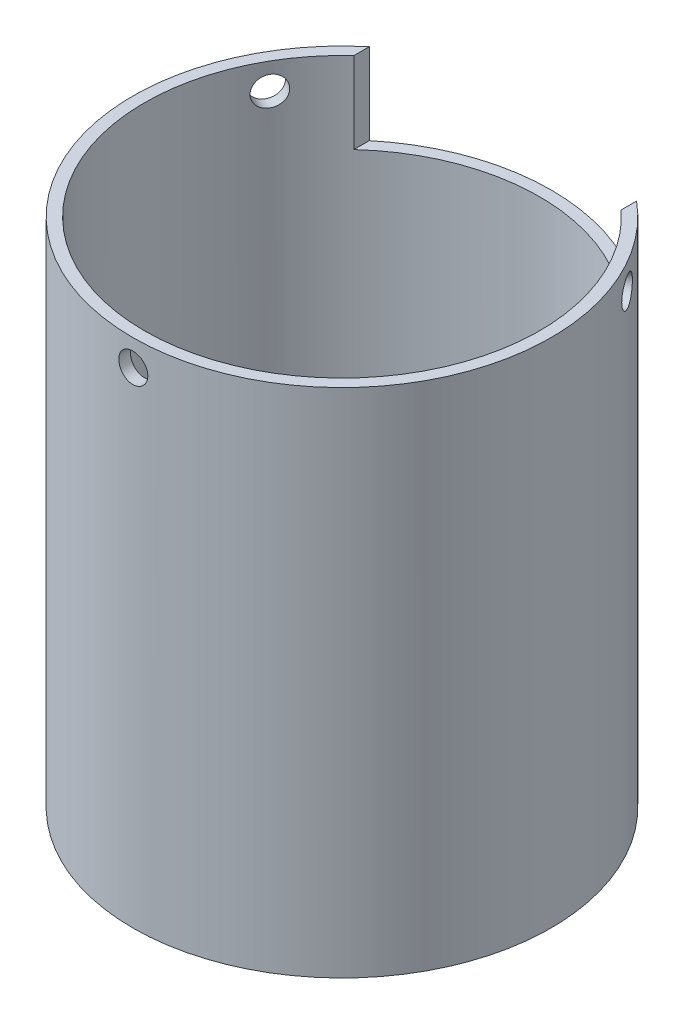
ISO-10303-21;
HEADER;
FILE_DESCRIPTION(('STEP AP214'),'2;1');
FILE_NAME('part.step','',(''),(''),'','','');
FILE_SCHEMA(('AUTOMOTIVE_DESIGN { 1 0 10303 214 1 1 1 1 }'));
ENDSEC;
DATA;
#1=APPLICATION_CONTEXT('core data for automotive mechanical design processes');
#2=APPLICATION_PROTOCOL_DEFINITION('international standard','automotive_design',2000,#1);
#3=PRODUCT_CONTEXT('',#1,'mechanical');
#4=PRODUCT('Part','Part','',(#3));
#5=PRODUCT_RELATED_PRODUCT_CATEGORY('part','',(#4));
#6=PRODUCT_DEFINITION_FORMATION('','',#4);
#7=PRODUCT_DEFINITION_CONTEXT('part definition',#1,'design');
#8=PRODUCT_DEFINITION('design','',#6,#7);
#9=PRODUCT_DEFINITION_SHAPE('','',#8);
#10=(LENGTH_UNIT() NAMED_UNIT(*) SI_UNIT(.MILLI.,.METRE.));
#11=(NAMED_UNIT(*) PLANE_ANGLE_UNIT() SI_UNIT($,.RADIAN.));
#12=(NAMED_UNIT(*) SI_UNIT($,.STERADIAN.) SOLID_ANGLE_UNIT());
#13=UNCERTAINTY_MEASURE_WITH_UNIT(LENGTH_MEASURE(1.E-05),#10,'distance_accuracy_value','');
#14=(GEOMETRIC_REPRESENTATION_CONTEXT(3) GLOBAL_UNCERTAINTY_ASSIGNED_CONTEXT((#13)) GLOBAL_UNIT_ASSIGNED_CONTEXT((#10,
#11,#12)) REPRESENTATION_CONTEXT('',''));
#15=CARTESIAN_POINT('',(0.,0.,0.));
#16=DIRECTION('',(0.,0.,1.));
#17=DIRECTION('',(1.,0.,0.));
#18=AXIS2_PLACEMENT_3D('',#15,#16,#17);
#19=CARTESIAN_POINT('',(0.,44.,0.));
#20=DIRECTION('',(0.,-1.,0.));
#21=DIRECTION('',(0.,0.,-1.));
#22=AXIS2_PLACEMENT_3D('',#19,#20,#21);
#23=CYLINDRICAL_SURFACE('',#22,18.);
#24=CARTESIAN_POINT('',(0.,44.,0.));
#25=DIRECTION('',(0.,1.,0.));
#26=DIRECTION('',(0.,0.,1.));
#27=AXIS2_PLACEMENT_3D('',#24,#25,#26);
#28=CIRCLE('',#27,18.);
#29=CARTESIAN_POINT('',(-11.5,44.,-13.8473824241262));
#30=VERTEX_POINT('',#29);
#31=CARTESIAN_POINT('',(11.5,44.,-13.8473824241262));
#32=VERTEX_POINT('',#31);
#33=EDGE_CURVE('E103',#30,#32,#28,.T.);
#34=ORIENTED_EDGE('',*,*,#33,.F.);
#35=DIRECTION('',(0.,-1.,0.));
#36=VECTOR('',#35,1.);
#37=CARTESIAN_POINT('',(-11.5,44.,-13.8473824241262));
#38=LINE('',#37,#36);
#39=CARTESIAN_POINT('',(-11.5,37.,-13.8473824241262));
#40=VERTEX_POINT('',#39);
#41=EDGE_CURVE('E88',#30,#40,#38,.T.);
#42=ORIENTED_EDGE('',*,*,#41,.T.);
#43=CARTESIAN_POINT('',(0.,37.,0.));
#44=DIRECTION('',(0.,1.,0.));
#45=DIRECTION('',(0.,0.,1.));
#46=AXIS2_PLACEMENT_3D('',#43,#44,#45);
#47=CIRCLE('',#46,18.);
#48=CARTESIAN_POINT('',(11.5,37.,-13.8473824241262));
#49=VERTEX_POINT('',#48);
#50=EDGE_CURVE('E160',#49,#40,#47,.T.);
#51=ORIENTED_EDGE('',*,*,#50,.F.);
#52=DIRECTION('',(0.,-1.,0.));
#53=VECTOR('',#52,1.);
#54=CARTESIAN_POINT('',(11.5,44.,-13.8473824241262));
#55=LINE('',#54,#53);
#56=EDGE_CURVE('E96',#32,#49,#55,.T.);
#57=ORIENTED_EDGE('',*,*,#56,.F.);
#58=EDGE_LOOP('',(#34,#42,#51,#57));
#59=FACE_BOUND('',#58,.T.);
#60=CARTESIAN_POINT('',(0.,0.,0.));
#61=DIRECTION('',(0.,1.,0.));
#62=DIRECTION('',(0.,0.,1.));
#63=AXIS2_PLACEMENT_3D('',#60,#61,#62);
#64=CIRCLE('',#63,18.);
#65=CARTESIAN_POINT('',(0.,0.,18.));
#66=VERTEX_POINT('',#65);
#67=EDGE_CURVE('E110',#66,#66,#64,.T.);
#68=ORIENTED_EDGE('',*,*,#67,.T.);
#69=EDGE_LOOP('',(#68));
#70=FACE_BOUND('',#69,.T.);
#71=CARTESIAN_POINT('',(-1.25,41.75,17.9565447678555));
#72=CARTESIAN_POINT('',(-1.24999692087245,41.679877836503,17.9565453475551));
#73=CARTESIAN_POINT('',(-1.24407962332092,41.60970698361,17.9569599379391));
#74=CARTESIAN_POINT('',(-1.22055995909646,41.47130405784,17.9585736340928));
#75=CARTESIAN_POINT('',(-1.2029441002899,41.4030743185426,17.9597736456779));
#76=CARTESIAN_POINT('',(-1.15653679886206,41.2705783633108,17.9628216098129));
#77=CARTESIAN_POINT('',(-1.12775138697274,41.2063100301731,17.9646692126594));
#78=CARTESIAN_POINT('',(-1.05983215341319,41.0835336767476,17.9688037374603));
#79=CARTESIAN_POINT('',(-1.0207006538079,41.0250243679489,17.9710905608051));
#80=CARTESIAN_POINT('',(-0.933122260331687,40.9153038614367,17.9758505608922));
#81=CARTESIAN_POINT('',(-0.884660449683299,40.8641045819849,17.9783240321337));
#82=CARTESIAN_POINT('',(-0.779828188185755,40.7705596374055,17.9831759029143));
#83=CARTESIAN_POINT('',(-0.723457402971796,40.7282143467834,17.9855542984285));
#84=CARTESIAN_POINT('',(-0.604338712936122,40.6535416920058,17.9899506663012));
#85=CARTESIAN_POINT('',(-0.541584512203469,40.6212243480678,17.9919682773059));
#86=CARTESIAN_POINT('',(-0.411524431040373,40.5675890860505,17.9954126129922));
#87=CARTESIAN_POINT('',(-0.344218608660133,40.5462710277191,17.9968393452081));
#88=CARTESIAN_POINT('',(-0.207082042920345,40.5152729844266,17.9989391241091));
#89=CARTESIAN_POINT('',(-0.137255588146259,40.5055741107522,17.9996133939115));
#90=CARTESIAN_POINT('',(0.00303724364685374,40.4980314019916,18.0001364029419));
#91=CARTESIAN_POINT('',(0.0735036120242584,40.5001874070499,17.9999851533017));
#92=CARTESIAN_POINT('',(0.212948009338198,40.5162777164302,17.9988751825149));
#93=CARTESIAN_POINT('',(0.281928395125417,40.530191704847,17.997917854153));
#94=CARTESIAN_POINT('',(0.416572169367042,40.5693714679473,17.995305076866));
#95=CARTESIAN_POINT('',(0.482235534552961,40.5946373222503,17.9936496230444));
#96=CARTESIAN_POINT('',(0.608446374060544,40.6558265082304,17.9898245419831));
#97=CARTESIAN_POINT('',(0.668989386654918,40.6917590140469,17.9876544724588));
#98=CARTESIAN_POINT('',(0.783192212040235,40.7732548424093,17.9830442781478));
#99=CARTESIAN_POINT('',(0.836851928584343,40.8188182995979,17.9806041495857));
#100=CARTESIAN_POINT('',(0.935883598513189,40.9183973197933,17.9757222588037));
#101=CARTESIAN_POINT('',(0.981237817297813,40.9724305221571,17.9732805040092));
#102=CARTESIAN_POINT('',(1.06223423290604,41.0873535287451,17.9686757864437));
#103=CARTESIAN_POINT('',(1.09787642481368,41.1482433364399,17.9665128238137));
#104=CARTESIAN_POINT('',(1.15843595045764,41.2751627451254,17.9627100242511));
#105=CARTESIAN_POINT('',(1.18335248496743,41.3411927287056,17.9610702263046));
#106=CARTESIAN_POINT('',(1.22174089648704,41.4765127406929,17.9585000082334));
#107=CARTESIAN_POINT('',(1.23521293993592,41.5458027216737,17.9575695777923));
#108=CARTESIAN_POINT('',(1.25030774544695,41.6855209974855,17.9565249662407));
#109=CARTESIAN_POINT('',(1.25195518340671,41.7559466142377,17.9564090853173));
#110=CARTESIAN_POINT('',(1.24341853566185,41.896073128502,17.9570021980803));
#111=CARTESIAN_POINT('',(1.23323452619032,41.9657740306807,17.9577111864519));
#112=CARTESIAN_POINT('',(1.20134459026408,42.1024024650606,17.9598725926874));
#113=CARTESIAN_POINT('',(1.17965007392972,42.1693326730866,17.9613242742845));
#114=CARTESIAN_POINT('',(1.12536652129504,42.2986024981628,17.9648068631197));
#115=CARTESIAN_POINT('',(1.0927773630921,42.3609420638377,17.9668377768389));
#116=CARTESIAN_POINT('',(1.01756674162157,42.4793742320995,17.9712540999677));
#117=CARTESIAN_POINT('',(0.974928771470821,42.535456329972,17.9736400902485));
#118=CARTESIAN_POINT('',(0.880854829968361,42.6396756721795,17.9784956909298));
#119=CARTESIAN_POINT('',(0.829418752879545,42.6878128210172,17.9809653023351));
#120=CARTESIAN_POINT('',(0.71910234587548,42.7748594442495,17.9857148668945));
#121=CARTESIAN_POINT('',(0.660209384545826,42.8137529311725,17.98799448709));
#122=CARTESIAN_POINT('',(0.536714304438726,42.8810986999746,17.9921024233477));
#123=CARTESIAN_POINT('',(0.472112227545764,42.9095510584462,17.9939307427204));
#124=CARTESIAN_POINT('',(0.339091057628252,42.9551792082367,17.9969285029299));
#125=CARTESIAN_POINT('',(0.270675425002747,42.9723650476595,17.998098530735));
#126=CARTESIAN_POINT('',(0.131921301517095,42.9950051871856,17.999650230487));
#127=CARTESIAN_POINT('',(0.0615828348509802,43.0004596348303,18.0000319123487));
#128=CARTESIAN_POINT('',(-0.0788622728534465,42.9994806529565,17.9999639410066));
#129=CARTESIAN_POINT('',(-0.148969090279524,42.9930722109983,17.9995160352152));
#130=CARTESIAN_POINT('',(-0.28710855262058,42.9686012623451,17.9978427052476));
#131=CARTESIAN_POINT('',(-0.355141194100978,42.9505387363535,17.996617279784));
#132=CARTESIAN_POINT('',(-0.48720416237324,42.9032782277334,17.9935265696128));
#133=CARTESIAN_POINT('',(-0.551234567790456,42.8740804639408,17.9916612974799));
#134=CARTESIAN_POINT('',(-0.673488058153857,42.8053815085425,17.9875000948006));
#135=CARTESIAN_POINT('',(-0.731711275829397,42.7658805525018,17.9852041741007));
#136=CARTESIAN_POINT('',(-0.840824910647018,42.6776034228431,17.9804340098156));
#137=CARTESIAN_POINT('',(-0.89170054489359,42.6288089961239,17.9779594213535));
#138=CARTESIAN_POINT('',(-0.98455733867083,42.5233581728663,17.973113669139));
#139=CARTESIAN_POINT('',(-1.02653632556802,42.4666998614811,17.9707425307619));
#140=CARTESIAN_POINT('',(-1.10044689471235,42.3470514074416,17.966368404823));
#141=CARTESIAN_POINT('',(-1.13236403890677,42.2840523355828,17.9643659479912));
#142=CARTESIAN_POINT('',(-1.18512806194755,42.1536205186862,17.960962587565));
#143=CARTESIAN_POINT('',(-1.2059878348875,42.0861930412755,17.9595609836776));
#144=CARTESIAN_POINT('',(-1.23065604288959,41.97363113737,17.9578832926674));
#145=CARTESIAN_POINT('',(-1.23790056796128,41.9292232721005,17.9573836081703));
#146=CARTESIAN_POINT('',(-1.24757352921097,41.8398836068265,17.9567141602468));
#147=CARTESIAN_POINT('',(-1.25000197387449,41.7949518077454,17.9565443962392));
#148=CARTESIAN_POINT('',(-1.25,41.75,17.9565447678555));
#149=B_SPLINE_CURVE_WITH_KNOTS('',3,(#71,#72,#73,#74,#75,#76,#77,#78,#79,#80,#81,#82,#83,#84,
#85,#86,#87,#88,#89,#90,#91,#92,#93,#94,#95,#96,#97,#98,#99,#100,#101,#102,#103,#104,#105,#106,
#107,#108,#109,#110,#111,#112,#113,#114,#115,#116,#117,#118,#119,#120,#121,#122,#123,#124,#125,
#126,#127,#128,#129,#130,#131,#132,#133,#134,#135,#136,#137,#138,#139,#140,#141,#142,#143,#144,
#145,#146,#147,#148),.UNSPECIFIED.,.T.,.F.,(4,2,2,2,2,2,2,2,2,2,2,2,2,2,2,2,2,2,2,2,2,2,2,2,2,2,
2,2,2,2,2,2,2,2,2,2,2,2,4),(0.,0.210202380966778,0.420647613628741,0.630979379191793,
0.841263978130896,1.05188760268292,1.26252013437695,1.47336246348711,1.6842021040758,
1.89469852632505,2.1051921101703,2.31532273683045,2.52545483732622,2.73576819379824,
2.94608449069139,3.15684476546426,3.36760514691818,3.57838123054665,3.78915424877224,
3.9994872920975,4.20981898019974,4.41994255945194,4.63006848990324,4.84054202380325,
5.0510180873868,5.2618555751644,5.47269151627751,5.68333916551951,5.89398416550928,
6.10418597529544,6.3143881331312,6.52458616017199,6.73477938181539,6.94538977792105,
7.15605154767914,7.36701424098654,7.57773038471112,7.71248084296796,7.84723106380576),.UNSPECIFIED.);
#150=CARTESIAN_POINT('',(-1.25,41.75,17.9565447678555));
#151=VERTEX_POINT('',#150);
#152=EDGE_CURVE('E106',#151,#151,#149,.T.);
#153=ORIENTED_EDGE('',*,*,#152,.F.);
#154=EDGE_LOOP('',(#153));
#155=FACE_BOUND('',#154,.T.);
#156=CARTESIAN_POINT('',(-14.9258239331555,41.75,-10.0608041386582));
#157=CARTESIAN_POINT('',(-14.9258259747539,41.679877836503,-10.0608017619053));
#158=CARTESIAN_POINT('',(-14.9291436693343,41.60970698361,-10.0558845270959));
#159=CARTESIAN_POINT('',(-14.9423010033096,41.4713040578399,-10.0363227484659));
#160=CARTESIAN_POINT('',(-14.9521481732305,41.4030743185426,-10.0216669730225));
#161=CARTESIAN_POINT('',(-14.9779914383151,41.2705783633107,-9.98300105313237));
#162=CARTESIAN_POINT('',(-14.9939842152609,41.2063100301731,-9.95899595660106));
#163=CARTESIAN_POINT('',(-15.0315244355509,41.0835336767476,-9.90224343733339));
#164=CARTESIAN_POINT('',(-15.0530706324641,41.0250243679489,-9.86949797625942));
#165=CARTESIAN_POINT('',(-15.1009821101996,40.9153038614367,-9.79603286272995));
#166=CARTESIAN_POINT('',(-15.1273551044545,40.8641045819849,-9.7553004392158));
#167=CARTESIAN_POINT('',(-15.1839730785552,40.7705596374055,-9.66693897301307));
#168=CARTESIAN_POINT('',(-15.2142182220977,40.7282143467834,-9.61930963874362));
#169=CARTESIAN_POINT('',(-15.2775849333777,40.6535416920058,-9.51834801104354));
#170=CARTESIAN_POINT('',(-15.310709336129,40.6212243480678,-9.46501008451723));
#171=CARTESIAN_POINT('',(-15.3787222589141,40.5675890860505,-9.35409691805487));
#172=CARTESIAN_POINT('',(-15.4136107564475,40.5462710277191,-9.29652173215889));
#173=CARTESIAN_POINT('',(-15.4839975011881,40.5152729844266,-9.17880787189102));
#174=CARTESIAN_POINT('',(-15.5194946633529,40.5055741107522,-9.11867352310161));
#175=CARTESIAN_POINT('',(-15.5900940183563,40.4980314019916,-8.99743787131515));
#176=CARTESIAN_POINT('',(-15.6251962165142,40.5001874070499,-8.93633658136777));
#177=CARTESIAN_POINT('',(-15.6939571522723,40.5162777164302,-8.81501920548508));
#178=CARTESIAN_POINT('',(-15.7276182744848,40.530191704847,-8.75480177484956));
#179=CARTESIAN_POINT('',(-15.7926774301007,40.5693714679473,-8.63689045725141));
#180=CARTESIAN_POINT('',(-15.8240754476293,40.5946373222503,-8.57919658799163));
#181=CARTESIAN_POINT('',(-15.8838682500125,40.6558265082304,-8.46798225421444));
#182=CARTESIAN_POINT('',(-15.9122604209737,40.6917590140469,-8.41446543252394));
#183=CARTESIAN_POINT('',(-15.9653692882765,40.7732548424093,-8.31325778740076));
#184=CARTESIAN_POINT('',(-15.9900859332253,40.8188182995979,-8.26556704543265));
#185=CARTESIAN_POINT('',(-16.0353739267541,40.9183973197933,-8.1773621581041));
#186=CARTESIAN_POINT('',(-16.0559364144646,40.9724305221571,-8.13686337507056));
#187=CARTESIAN_POINT('',(-16.0924468198796,41.0873535287451,-8.06441606275557));
#188=CARTESIAN_POINT('',(-16.1083947352485,41.1482433364399,-8.03246753780203));
#189=CARTESIAN_POINT('',(-16.1353811770437,41.2751627451254,-7.97812005037191));
#190=CARTESIAN_POINT('',(-16.1464193376199,41.3411927287056,-7.95572179953891));
#191=CARTESIAN_POINT('',(-16.1633876692368,41.4765127406929,-7.92119135091641));
#192=CARTESIAN_POINT('',(-16.1693179145628,41.5458027216737,-7.90905900382824));
#193=CARTESIAN_POINT('',(-16.1759606571775,41.6855209974855,-7.89546421301469));
#194=CARTESIAN_POINT('',(-16.1766840203339,41.7559466142377,-7.89397954942867));
#195=CARTESIAN_POINT('',(-16.1729293471815,41.896073128502,-7.90166905962039));
#196=CARTESIAN_POINT('',(-16.1684513443866,41.9657740306807,-7.91084316472093));
#197=CARTESIAN_POINT('',(-16.1543782091313,42.1024024650606,-7.93954136247588));
#198=CARTESIAN_POINT('',(-16.1447881441054,42.1693326730866,-7.95905520554278));
#199=CARTESIAN_POINT('',(-16.1206623781903,42.2986024981628,-8.00780743554967));
#200=CARTESIAN_POINT('',(-16.1061266219626,42.3609420638377,-8.03704593130099));
#201=CARTESIAN_POINT('',(-16.0723459592482,42.4793742320995,-8.10438840169329));
#202=CARTESIAN_POINT('',(-16.0530933023691,42.535456329972,-8.14250696215001));
#203=CARTESIAN_POINT('',(-16.0102614051586,42.6396756721795,-8.22640518566594));
#204=CARTESIAN_POINT('',(-15.9866821128286,42.6878128210172,-8.27218494079853));
#205=CARTESIAN_POINT('',(-15.9356371528919,42.7748594442495,-8.37009653399795));
#206=CARTESIAN_POINT('',(-15.9081648812274,42.8137529311725,-8.4222391447113));
#207=CARTESIAN_POINT('',(-15.8499749183301,42.8810986999746,-8.53124298945529));
#208=CARTESIAN_POINT('',(-15.8192572509066,42.9095510584462,-8.58810418886817));
#209=CARTESIAN_POINT('',(-15.7553428024437,42.9551792082367,-8.7048027813626));
#210=CARTESIAN_POINT('',(-15.7221482599334,42.9723650476595,-8.76463747113484));
#211=CARTESIAN_POINT('',(-15.6541150095948,42.9950051871856,-8.88557791682927));
#212=CARTESIAN_POINT('',(-15.6192763224501,43.0004596348303,-8.94668365675618));
#213=CARTESIAN_POINT('',(-15.548994903689,42.9994806529565,-9.06827870219444));
#214=CARTESIAN_POINT('',(-15.5135535971821,42.9930722109983,-9.12876903416821));
#215=CARTESIAN_POINT('',(-15.4430347197507,42.9686012623451,-9.24756465283689));
#216=CARTESIAN_POINT('',(-15.4079571494286,42.9505387363535,-9.30586993591366));
#217=CARTESIAN_POINT('',(-15.3392490317684,42.9032782277334,-9.41869446625101));
#218=CARTESIAN_POINT('',(-15.3056184560077,42.8740804639408,-9.47321378789047));
#219=CARTESIAN_POINT('',(-15.2408880035955,42.8053815085425,-9.57700781490686));
#220=CARTESIAN_POINT('',(-15.2097880691065,42.7658805525018,-9.62628264015397));
#221=CARTESIAN_POINT('',(-15.1511001682465,42.6776034228431,-9.71839273766274));
#222=CARTESIAN_POINT('',(-15.1235192946512,42.6288089961239,-9.76121503512288));
#223=CARTESIAN_POINT('',(-15.0728943532444,42.5233581728663,-9.83920850134069));
#224=CARTESIAN_POINT('',(-15.0498513937254,42.4666998614811,-9.87437780123026));
#225=CARTESIAN_POINT('',(-15.0091080049708,42.3470514074416,-9.93619916874798));
#226=CARTESIAN_POINT('',(-14.9914152543872,42.2840523355828,-9.96283899802066));
#227=CARTESIAN_POINT('',(-14.9620858462795,42.1536205186862,-10.0068323021668));
#228=CARTESIAN_POINT('',(-14.950442135237,42.0861930412755,-10.0241965935062));
#229=CARTESIAN_POINT('',(-14.9366551082014,41.97363113737,-10.0447210427968));
#230=CARTESIAN_POINT('',(-14.9326001061972,41.9292232721005,-10.0507451432987));
#231=CARTESIAN_POINT('',(-14.9271838666641,41.8398836068265,-10.058787449509));
#232=CARTESIAN_POINT('',(-14.9258226243891,41.7949518077454,-10.0608056622754));
#233=CARTESIAN_POINT('',(-14.9258239331555,41.75,-10.0608041386582));
#234=B_SPLINE_CURVE_WITH_KNOTS('',3,(#156,#157,#158,#159,#160,#161,#162,#163,#164,#165,#166,
#167,#168,#169,#170,#171,#172,#173,#174,#175,#176,#177,#178,#179,#180,#181,#182,#183,#184,#185,
#186,#187,#188,#189,#190,#191,#192,#193,#194,#195,#196,#197,#198,#199,#200,#201,#202,#203,#204,
#205,#206,#207,#208,#209,#210,#211,#212,#213,#214,#215,#216,#217,#218,#219,#220,#221,#222,#223,
#224,#225,#226,#227,#228,#229,#230,#231,#232,#233),.UNSPECIFIED.,.T.,.F.,(4,2,2,2,2,2,2,2,2,2,2,
2,2,2,2,2,2,2,2,2,2,2,2,2,2,2,2,2,2,2,2,2,2,2,2,2,2,2,4),(0.,0.210202380966778,
0.420647613628749,0.630979379191801,0.841263978130896,1.05188760268292,1.26252013437696,
1.47336246348711,1.68420210407581,1.89469852632506,2.10519211017031,2.31532273683046,
2.52545483732623,2.73576819379824,2.9460844906914,3.15684476546427,3.36760514691818,
3.57838123054666,3.78915424877224,3.99948729209751,4.20981898019975,4.41994255945194,
4.63006848990324,4.84054202380325,5.0510180873868,5.26185557516442,5.47269151627752,
5.68333916551952,5.89398416550928,6.10418597529545,6.3143881331312,6.52458616017199,
6.7347793818154,6.94538977792106,7.15605154767915,7.36701424098655,7.57773038471113,
7.71248084296796,7.84723106380576),.UNSPECIFIED.);
#235=CARTESIAN_POINT('',(-14.9258239331555,41.75,-10.0608041386582));
#236=VERTEX_POINT('',#235);
#237=EDGE_CURVE('E198',#236,#236,#234,.T.);
#238=ORIENTED_EDGE('',*,*,#237,.F.);
#239=EDGE_LOOP('',(#238));
#240=FACE_BOUND('',#239,.T.);
#241=CARTESIAN_POINT('',(16.1758239331554,41.75,-7.89574062919729));
#242=CARTESIAN_POINT('',(16.1758228956262,41.679877836503,-7.89574358564976));
#243=CARTESIAN_POINT('',(16.1732232926551,41.60970698361,-7.90107541084313));
#244=CARTESIAN_POINT('',(16.162860962406,41.4713040578399,-7.92225088562682));
#245=CARTESIAN_POINT('',(16.1550922735202,41.4030743185426,-7.93810667265536));
#246=CARTESIAN_POINT('',(16.134528237177,41.2705783633107,-7.97982055668044));
#247=CARTESIAN_POINT('',(16.1217356022335,41.2063100301731,-8.00567325605823));
#248=CARTESIAN_POINT('',(16.0913565889639,41.0835336767476,-8.06656030012683));
#249=CARTESIAN_POINT('',(16.0737712862718,41.0250243679489,-8.10159258454558));
#250=CARTESIAN_POINT('',(16.0341043705312,40.9153038614367,-8.17981769816217));
#251=CARTESIAN_POINT('',(16.0120155541376,40.8641045819849,-8.22302359291781));
#252=CARTESIAN_POINT('',(15.9638012667408,40.7705596374055,-8.31623692990118));
#253=CARTESIAN_POINT('',(15.9376756250694,40.7282143467834,-8.36624465968486));
#254=CARTESIAN_POINT('',(15.8819236463137,40.6535416920058,-8.47160265525761));
#255=CARTESIAN_POINT('',(15.8522938483324,40.6212243480678,-8.52695819278864));
#256=CARTESIAN_POINT('',(15.7902466899543,40.5675890860505,-8.64131569493729));
#257=CARTESIAN_POINT('',(15.7578293651075,40.5462710277191,-8.7003176130491));
#258=CARTESIAN_POINT('',(15.6910795441083,40.5152729844266,-8.82013125221805));
#259=CARTESIAN_POINT('',(15.656750251499,40.5055741107522,-8.88093987080977));
#260=CARTESIAN_POINT('',(15.5870567747093,40.4980314019916,-9.0026985316267));
#261=CARTESIAN_POINT('',(15.5516926044898,40.5001874070499,-9.06364857193384));
#262=CARTESIAN_POINT('',(15.481009142934,40.5162777164302,-9.18385597702972));
#263=CARTESIAN_POINT('',(15.4456898793592,40.530191704847,-9.24311607930336));
#264=CARTESIAN_POINT('',(15.3761052607335,40.5693714679473,-9.35841461961454));
#265=CARTESIAN_POINT('',(15.3418399130762,40.5946373222503,-9.41445303505273));
#266=CARTESIAN_POINT('',(15.2754218759518,40.6558265082304,-9.52184228776859));
#267=CARTESIAN_POINT('',(15.2432710343186,40.6917590140469,-9.57318903993483));
#268=CARTESIAN_POINT('',(15.1821770762362,40.7732548424093,-9.66978649074693));
#269=CARTESIAN_POINT('',(15.1532340046409,40.8188182995979,-9.71503710415296));
#270=CARTESIAN_POINT('',(15.0994903282408,40.9183973197933,-9.79836010069956));
#271=CARTESIAN_POINT('',(15.0746985971666,40.9724305221571,-9.83641712893859));
#272=CARTESIAN_POINT('',(15.0302125869735,41.0873535287451,-9.90425972368801));
#273=CARTESIAN_POINT('',(15.0105183104347,41.1482433364399,-9.93404528601162));
#274=CARTESIAN_POINT('',(14.976945226586,41.2751627451254,-9.98458997387912));
#275=CARTESIAN_POINT('',(14.9630668526523,41.3411927287056,-10.0053484267656));
#276=CARTESIAN_POINT('',(14.9416467727496,41.4765127406929,-10.0373086573169));
#277=CARTESIAN_POINT('',(14.9341049746267,41.5458027216737,-10.048510573964));
#278=CARTESIAN_POINT('',(14.9256529117304,41.6855209974855,-10.0610607532259));
#279=CARTESIAN_POINT('',(14.924728836927,41.7559466142377,-10.0624295358885));
#280=CARTESIAN_POINT('',(14.9295108115196,41.896073128502,-10.0553331384598));
#281=CARTESIAN_POINT('',(14.9352168181961,41.9657740306807,-10.0468680217309));
#282=CARTESIAN_POINT('',(14.9530336188671,42.1024024650606,-10.0203312302115));
#283=CARTESIAN_POINT('',(14.9651380701756,42.1693326730866,-10.0022690687417));
#284=CARTESIAN_POINT('',(14.9952958568951,42.2986024981628,-9.95699942756995));
#285=CARTESIAN_POINT('',(15.0133492588703,42.3609420638377,-9.92979184553787));
#286=CARTESIAN_POINT('',(15.0547792176265,42.4793742320995,-9.86686569827437));
#287=CARTESIAN_POINT('',(15.0781645308982,42.535456329972,-9.83113312809839));
#288=CARTESIAN_POINT('',(15.1294065751901,42.6396756721795,-9.7520905052638));
#289=CARTESIAN_POINT('',(15.1572633599489,42.6878128210172,-9.70878036153653));
#290=CARTESIAN_POINT('',(15.2165348070163,42.7748594442495,-9.61561833289646));
#291=CARTESIAN_POINT('',(15.2479554966815,42.8137529311725,-9.56575534237865));
#292=CARTESIAN_POINT('',(15.3132606138913,42.8810986999746,-9.46085943389235));
#293=CARTESIAN_POINT('',(15.3471450233607,42.9095510584462,-9.40582655385215));
#294=CARTESIAN_POINT('',(15.4162517448154,42.9551792082367,-9.2921257215672));
#295=CARTESIAN_POINT('',(15.4514728349305,42.9723650476595,-9.23346105960009));
#296=CARTESIAN_POINT('',(15.5221937080776,42.9950051871856,-9.11407231365769));
#297=CARTESIAN_POINT('',(15.557693487599,43.0004596348303,-9.0533482555924));
#298=CARTESIAN_POINT('',(15.6278571765423,42.9994806529565,-8.93168523881212));
#299=CARTESIAN_POINT('',(15.6625226874615,42.9930722109983,-8.87074700104696));
#300=CARTESIAN_POINT('',(15.7301432723712,42.9686012623451,-8.75027805241068));
#301=CARTESIAN_POINT('',(15.7630983435294,42.9505387363535,-8.69074734387029));
#302=CARTESIAN_POINT('',(15.8264531941415,42.9032782277334,-8.57483210336173));
#303=CARTESIAN_POINT('',(15.8568530237981,42.8740804639408,-8.51844750958934));
#304=CARTESIAN_POINT('',(15.9143760617492,42.8053815085425,-8.41049227989368));
#305=CARTESIAN_POINT('',(15.9414993449358,42.7658805525018,-8.35892153394662));
#306=CARTESIAN_POINT('',(15.9919250788934,42.6776034228431,-8.26204127215275));
#307=CARTESIAN_POINT('',(16.0152198395447,42.6288089961239,-8.21674438623054));
#308=CARTESIAN_POINT('',(16.0574516919151,42.5233581728663,-8.13390516779823));
#309=CARTESIAN_POINT('',(16.0763877192932,42.4666998614811,-8.09636472953159));
#310=CARTESIAN_POINT('',(16.109554899683,42.3470514074416,-8.030169236075));
#311=CARTESIAN_POINT('',(16.1237792932938,42.2840523355828,-8.00152694997045));
#312=CARTESIAN_POINT('',(16.1472139082269,42.1536205186862,-7.95413028539818));
#313=CARTESIAN_POINT('',(16.1564299701244,42.0861930412755,-7.93536439017131));
#314=CARTESIAN_POINT('',(16.1673111510909,41.97363113737,-7.91316224987056));
#315=CARTESIAN_POINT('',(16.1705006741584,41.9292232721005,-7.90663846487158));
#316=CARTESIAN_POINT('',(16.174757395875,41.8398836068265,-7.89792671073779));
#317=CARTESIAN_POINT('',(16.1758245982634,41.7949518077454,-7.89573873396366));
#318=CARTESIAN_POINT('',(16.1758239331554,41.75,-7.89574062919729));
#319=B_SPLINE_CURVE_WITH_KNOTS('',3,(#241,#242,#243,#244,#245,#246,#247,#248,#249,#250,#251,
#252,#253,#254,#255,#256,#257,#258,#259,#260,#261,#262,#263,#264,#265,#266,#267,#268,#269,#270,
#271,#272,#273,#274,#275,#276,#277,#278,#279,#280,#281,#282,#283,#284,#285,#286,#287,#288,#289,
#290,#291,#292,#293,#294,#295,#296,#297,#298,#299,#300,#301,#302,#303,#304,#305,#306,#307,#308,
#309,#310,#311,#312,#313,#314,#315,#316,#317,#318),.UNSPECIFIED.,.T.,.F.,(4,2,2,2,2,2,2,2,2,2,2,
2,2,2,2,2,2,2,2,2,2,2,2,2,2,2,2,2,2,2,2,2,2,2,2,2,2,2,4),(0.,0.210202380966779,
0.420647613628749,0.6309793791918,0.841263978130897,1.05188760268293,1.26252013437696,
1.47336246348711,1.68420210407581,1.89469852632505,2.10519211017031,2.31532273683046,
2.52545483732623,2.73576819379824,2.9460844906914,3.15684476546426,3.36760514691818,
3.57838123054666,3.78915424877224,3.99948729209751,4.20981898019975,4.41994255945194,
4.63006848990324,4.84054202380325,5.0510180873868,5.26185557516442,5.47269151627752,
5.68333916551952,5.89398416550928,6.10418597529545,6.3143881331312,6.52458616017199,
6.7347793818154,6.94538977792106,7.15605154767915,7.36701424098655,7.57773038471113,
7.71248084296795,7.84723106380576),.UNSPECIFIED.);
#320=CARTESIAN_POINT('',(16.1758239331554,41.75,-7.89574062919729));
#321=VERTEX_POINT('',#320);
#322=EDGE_CURVE('E126',#321,#321,#319,.T.);
#323=ORIENTED_EDGE('',*,*,#322,.F.);
#324=EDGE_LOOP('',(#323));
#325=FACE_BOUND('',#324,.T.);
#326=ADVANCED_FACE('F41',(#59,#70,#155,#240,#325),#23,.T.);
#327=CARTESIAN_POINT('',(0.,0.,0.));
#328=DIRECTION('',(0.,1.,0.));
#329=DIRECTION('',(0.,0.,1.));
#330=AXIS2_PLACEMENT_3D('',#327,#328,#329);
#331=CYLINDRICAL_SURFACE('',#330,17.);
#332=CARTESIAN_POINT('',(0.,37.,0.));
#333=DIRECTION('',(0.,1.,0.));
#334=DIRECTION('',(0.,0.,1.));
#335=AXIS2_PLACEMENT_3D('',#332,#333,#334);
#336=CIRCLE('',#335,17.);
#337=CARTESIAN_POINT('',(-11.5,37.,-12.5199840255489));
#338=VERTEX_POINT('',#337);
#339=CARTESIAN_POINT('',(11.5,37.,-12.5199840255489));
#340=VERTEX_POINT('',#339);
#341=EDGE_CURVE('E68',#338,#340,#336,.F.);
#342=ORIENTED_EDGE('',*,*,#341,.F.);
#343=DIRECTION('',(0.,1.,0.));
#344=VECTOR('',#343,1.);
#345=CARTESIAN_POINT('',(-11.5,0.,-12.5199840255489));
#346=LINE('',#345,#344);
#347=CARTESIAN_POINT('',(-11.5,44.,-12.5199840255489));
#348=VERTEX_POINT('',#347);
#349=EDGE_CURVE('E11',#338,#348,#346,.T.);
#350=ORIENTED_EDGE('',*,*,#349,.T.);
#351=CARTESIAN_POINT('',(0.,44.,0.));
#352=DIRECTION('',(0.,1.,0.));
#353=DIRECTION('',(0.,0.,1.));
#354=AXIS2_PLACEMENT_3D('',#351,#352,#353);
#355=CIRCLE('',#354,17.);
#356=CARTESIAN_POINT('',(11.5,44.,-12.5199840255489));
#357=VERTEX_POINT('',#356);
#358=EDGE_CURVE('E95',#348,#357,#355,.T.);
#359=ORIENTED_EDGE('',*,*,#358,.T.);
#360=DIRECTION('',(0.,1.,0.));
#361=VECTOR('',#360,1.);
#362=CARTESIAN_POINT('',(11.5,0.,-12.5199840255489));
#363=LINE('',#362,#361);
#364=EDGE_CURVE('E55',#340,#357,#363,.T.);
#365=ORIENTED_EDGE('',*,*,#364,.F.);
#366=EDGE_LOOP('',(#342,#350,#359,#365));
#367=FACE_BOUND('',#366,.T.);
#368=CARTESIAN_POINT('',(0.,0.,0.));
#369=DIRECTION('',(0.,1.,0.));
#370=DIRECTION('',(0.,0.,1.));
#371=AXIS2_PLACEMENT_3D('',#368,#369,#370);
#372=CIRCLE('',#371,17.);
#373=CARTESIAN_POINT('',(0.,0.,17.));
#374=VERTEX_POINT('',#373);
#375=EDGE_CURVE('E114',#374,#374,#372,.T.);
#376=ORIENTED_EDGE('',*,*,#375,.F.);
#377=EDGE_LOOP('',(#376));
#378=FACE_BOUND('',#377,.T.);
#379=CARTESIAN_POINT('',(0.,40.5,17.));
#380=CARTESIAN_POINT('',(-0.0701114374009971,40.5000030741595,16.9999993933768));
#381=CARTESIAN_POINT('',(-0.140271293942132,40.5059185679737,16.9995616381418));
#382=CARTESIAN_POINT('',(-0.278651803569587,40.5294306541654,16.9978574325815));
#383=CARTESIAN_POINT('',(-0.346870135286048,40.5470406636482,16.9965900304269));
#384=CARTESIAN_POINT('',(-0.479343249225229,40.5934315346574,16.9933698319174));
#385=CARTESIAN_POINT('',(-0.543600175220228,40.6222062916165,16.9914174101675));
#386=CARTESIAN_POINT('',(-0.666355921045813,40.6900994324505,16.9870464492067));
#387=CARTESIAN_POINT('',(-0.724856012576291,40.729215524827,16.9846280132903));
#388=CARTESIAN_POINT('',(-0.834571599289305,40.816766681498,16.9795911820933));
#389=CARTESIAN_POINT('',(-0.885773905619763,40.8652182548548,16.9769724376049));
#390=CARTESIAN_POINT('',(-0.979327467680685,40.9700304522096,16.971833091802));
#391=CARTESIAN_POINT('',(-1.02167834436435,41.0263914147405,16.9693124946942));
#392=CARTESIAN_POINT('',(-1.09636989797495,41.1455002880737,16.9646508997728));
#393=CARTESIAN_POINT('',(-1.12869924106479,41.2082553244832,16.9625103329139));
#394=CARTESIAN_POINT('',(-1.18235757434903,41.3383211621011,16.9588548577996));
#395=CARTESIAN_POINT('',(-1.20368672024734,41.4056318988099,16.9573399406884));
#396=CARTESIAN_POINT('',(-1.23470160843389,41.5427682688427,16.9551100202027));
#397=CARTESIAN_POINT('',(-1.2444085150376,41.612589091601,16.954393562983));
#398=CARTESIAN_POINT('',(-1.25196874085017,41.7528724518517,16.9538370102126));
#399=CARTESIAN_POINT('',(-1.24982223782256,41.8233349797048,16.9539969015194));
#400=CARTESIAN_POINT('',(-1.23375409879929,41.9627569607445,16.9551736661373));
#401=CARTESIAN_POINT('',(-1.2198554129539,42.031719074958,16.9561888691461));
#402=CARTESIAN_POINT('',(-1.18071306766582,42.1663288960704,16.9589592357487));
#403=CARTESIAN_POINT('',(-1.15546931902006,42.2319765769042,16.9607144051605));
#404=CARTESIAN_POINT('',(-1.09432754752815,42.3581674796549,16.9647688493341));
#405=CARTESIAN_POINT('',(-1.05841917020422,42.4187056669766,16.9670686524487));
#406=CARTESIAN_POINT('',(-0.976974930058655,42.532904079691,16.9719527073521));
#407=CARTESIAN_POINT('',(-0.931438916113302,42.5865641970983,16.9745369636057));
#408=CARTESIAN_POINT('',(-0.831903010117662,42.6856167413154,16.9797061473361));
#409=CARTESIAN_POINT('',(-0.777883266806279,42.7309892230677,16.9822910618214));
#410=CARTESIAN_POINT('',(-0.662982748302863,42.8120245131817,16.9871644111301));
#411=CARTESIAN_POINT('',(-0.602101969745842,42.8476873167812,16.989452845808));
#412=CARTESIAN_POINT('',(-0.475195034746846,42.9082894481975,16.9934756796063));
#413=CARTESIAN_POINT('',(-0.409168485963104,42.9332279573884,16.995210036429));
#414=CARTESIAN_POINT('',(-0.27384993314137,42.9716599483506,16.997928768922));
#415=CARTESIAN_POINT('',(-0.204557981882796,42.9851536150403,16.9989131567097));
#416=CARTESIAN_POINT('',(-0.0648485325756377,43.000288027125,17.0000194759722));
#417=CARTESIAN_POINT('',(0.00556596447100751,43.0019563352815,17.0001434129875));
#418=CARTESIAN_POINT('',(0.145673719645362,42.9934647830769,16.999520211201));
#419=CARTESIAN_POINT('',(0.215366982988249,42.983305008304,16.9987730787023));
#420=CARTESIAN_POINT('',(0.351975823839943,42.9514685222809,16.9964930937958));
#421=CARTESIAN_POINT('',(0.418894379105058,42.9298045211114,16.9949611085735));
#422=CARTESIAN_POINT('',(0.548146305699547,42.875587487623,16.9912836430185));
#423=CARTESIAN_POINT('',(0.610479620203658,42.8430343203816,16.9891381550843));
#424=CARTESIAN_POINT('',(0.728917485090242,42.7678932982106,16.9844694753328));
#425=CARTESIAN_POINT('',(0.785010375482229,42.725287108047,16.9819455964897));
#426=CARTESIAN_POINT('',(0.889257583979709,42.6312760608009,16.9768062475212));
#427=CARTESIAN_POINT('',(0.93741179454865,42.5798710845503,16.9741907761557));
#428=CARTESIAN_POINT('',(1.02450867468886,42.4696024035083,16.969157145074));
#429=CARTESIAN_POINT('',(1.06343341076884,42.4107245135098,16.9667393753788));
#430=CARTESIAN_POINT('',(1.13084360004715,42.2872522808424,16.9623801004555));
#431=CARTESIAN_POINT('',(1.1593291374878,42.2226579843092,16.9604385913842));
#432=CARTESIAN_POINT('',(1.20502152278709,42.0896510456962,16.9572536347735));
#433=CARTESIAN_POINT('',(1.22223950480995,42.0212422457443,16.9560094982923));
#434=CARTESIAN_POINT('',(1.2449443326339,41.8824951841042,16.9543577058632));
#435=CARTESIAN_POINT('',(1.25043134841209,41.8121569503878,16.9539500377952));
#436=CARTESIAN_POINT('',(1.24951670411438,41.6717259158801,16.9540174585878));
#437=CARTESIAN_POINT('',(1.24314322823114,41.6016329287845,16.9544904547196));
#438=CARTESIAN_POINT('',(1.21874712194013,41.4635154830457,16.9562614672111));
#439=CARTESIAN_POINT('',(1.2007244719104,41.3954910278871,16.9575594849605));
#440=CARTESIAN_POINT('',(1.15354838382055,41.2634386297722,16.9608337452766));
#441=CARTESIAN_POINT('',(1.12439527049729,41.1994105702826,16.9628099680561));
#442=CARTESIAN_POINT('',(1.05578922987079,41.0771534712975,16.9672179652148));
#443=CARTESIAN_POINT('',(1.01633651723158,41.0189243109763,16.9696497300992));
#444=CARTESIAN_POINT('',(0.928145776837638,40.9097741158545,16.9747016202101));
#445=CARTESIAN_POINT('',(0.879387052645931,40.8588698226184,16.9773221570186));
#446=CARTESIAN_POINT('',(0.774002405696153,40.7659493063793,16.9824526257481));
#447=CARTESIAN_POINT('',(0.717374571735222,40.7239352488567,16.984962530604));
#448=CARTESIAN_POINT('',(0.597772870871223,40.6499445235424,16.9895924658213));
#449=CARTESIAN_POINT('',(0.534789354121444,40.6179834315121,16.9917118890984));
#450=CARTESIAN_POINT('',(0.404378773565798,40.5651300268143,16.9953145073056));
#451=CARTESIAN_POINT('',(0.33695696919703,40.5442248690511,16.9967984401831));
#452=CARTESIAN_POINT('',(0.224274859262746,40.5194563435997,16.9985779069779));
#453=CARTESIAN_POINT('',(0.179741172690334,40.5121697784924,16.9991087934339));
#454=CARTESIAN_POINT('',(0.0901449965786592,40.5024406231473,16.9998200346295));
#455=CARTESIAN_POINT('',(0.0450825080910237,40.499998023278,17.0000003900661));
#456=CARTESIAN_POINT('',(0.,40.5,17.));
#457=B_SPLINE_CURVE_WITH_KNOTS('',3,(#379,#380,#381,#382,#383,#384,#385,#386,#387,#388,#389,
#390,#391,#392,#393,#394,#395,#396,#397,#398,#399,#400,#401,#402,#403,#404,#405,#406,#407,#408,
#409,#410,#411,#412,#413,#414,#415,#416,#417,#418,#419,#420,#421,#422,#423,#424,#425,#426,#427,
#428,#429,#430,#431,#432,#433,#434,#435,#436,#437,#438,#439,#440,#441,#442,#443,#444,#445,#446,
#447,#448,#449,#450,#451,#452,#453,#454,#455,#456),.UNSPECIFIED.,.T.,.F.,(4,2,2,2,2,2,2,2,2,2,2,
2,2,2,2,2,2,2,2,2,2,2,2,2,2,2,2,2,2,2,2,2,2,2,2,2,2,2,4),(0.,0.210169723307803,
0.420580991660816,0.630877374853583,0.841127198246116,1.05175230222976,1.2623864240133,
1.47325790024809,1.68412639158951,1.89461030057573,2.1050910529795,2.31516171660797,
2.52523403199222,2.73551098084577,2.94579123063313,3.15657105924424,3.36735099123255,
3.57814700999211,3.78893962277711,3.99924075424873,4.20954036398732,4.41960811277421,
4.62967846450943,4.84013495628747,5.05059429865368,5.26145928663837,5.47232257294589,
5.68297717637262,5.89362872747598,6.10378034450654,6.313932315519,6.52407815571083,
6.7342196163976,6.94483399244587,7.15549961096418,7.36649003871079,7.57723479030044,
7.71237675062036,7.8475184422294),.UNSPECIFIED.);
#458=CARTESIAN_POINT('',(0.,40.5,17.));
#459=VERTEX_POINT('',#458);
#460=EDGE_CURVE('E120',#459,#459,#457,.T.);
#461=ORIENTED_EDGE('',*,*,#460,.F.);
#462=EDGE_LOOP('',(#461));
#463=FACE_BOUND('',#462,.T.);
#464=CARTESIAN_POINT('',(-14.057578962839,41.75,-9.55952267132341));
#465=CARTESIAN_POINT('',(-14.0575810307132,41.8201111485011,-9.55952031517606));
#466=CARTESIAN_POINT('',(-14.0609189141048,41.8902707170975,-9.55461687354699));
#467=CARTESIAN_POINT('',(-14.07415450223,42.028650628428,-9.53510926101434));
#468=CARTESIAN_POINT('',(-14.084059742288,42.0968686495666,-9.52049394675462));
#469=CARTESIAN_POINT('',(-14.1100496051226,42.2293411069162,-9.4819321643918));
#470=CARTESIAN_POINT('',(-14.1261308468296,42.29359768953,-9.45799080175803));
#471=CARTESIAN_POINT('',(-14.1638678342716,42.416352860508,-9.40138285238029));
#472=CARTESIAN_POINT('',(-14.1855223454154,42.4748527201398,-9.36871819796059));
#473=CARTESIAN_POINT('',(-14.2336623507981,42.5845685707836,-9.29541695982874));
#474=CARTESIAN_POINT('',(-14.260156446732,42.6357712989972,-9.25476617199498));
#475=CARTESIAN_POINT('',(-14.3170121923253,42.7293256747043,-9.16656474026222));
#476=CARTESIAN_POINT('',(-14.3473740069586,42.7716769444439,-9.11901380203213));
#477=CARTESIAN_POINT('',(-14.4109608789695,42.8463689074536,-9.01819035354569));
#478=CARTESIAN_POINT('',(-14.4441891040493,42.8786983395264,-8.96491149687352));
#479=CARTESIAN_POINT('',(-14.5123816062767,42.9323568595605,-8.85409556578272));
#480=CARTESIAN_POINT('',(-14.5473458590126,42.9536861021572,-8.7965585512362));
#481=CARTESIAN_POINT('',(-14.617840369812,42.9847011948061,-8.67890745865083));
#482=CARTESIAN_POINT('',(-14.6533694788347,42.9944082168113,-8.61879827389332));
#483=CARTESIAN_POINT('',(-14.723991687885,43.0019687382939,-8.49758717631651));
#484=CARTESIAN_POINT('',(-14.7590847943982,42.9998224143044,-8.43648527829531));
#485=CARTESIAN_POINT('',(-14.8277797748081,42.9837545569685,-8.31515478993129));
#486=CARTESIAN_POINT('',(-14.8613844001873,42.9698557935984,-8.25492473976552));
#487=CARTESIAN_POINT('',(-14.9262964817956,42.930712962581,-8.13696556226447));
#488=CARTESIAN_POINT('',(-14.9576039203128,42.9054688074681,-8.0792364542136));
#489=CARTESIAN_POINT('',(-15.0171945119408,42.8443261980207,-7.96792712563527));
#490=CARTESIAN_POINT('',(-15.0454747171289,42.8084174846502,-7.9143509630031));
#491=CARTESIAN_POINT('',(-15.0983480694033,42.7269725292354,-7.8130120650642));
#492=CARTESIAN_POINT('',(-15.122941158529,42.6814361358735,-7.76524942114675));
#493=CARTESIAN_POINT('',(-15.1679905133788,42.581899962943,-7.67688315467353));
#494=CARTESIAN_POINT('',(-15.1884368511821,42.5278804090157,-7.63629674212073));
#495=CARTESIAN_POINT('',(-15.2247298423946,42.4129804284391,-7.5636799576469));
#496=CARTESIAN_POINT('',(-15.2405764931162,42.352099997781,-7.53164959072519));
#497=CARTESIAN_POINT('',(-15.2673876292364,42.2251931523578,-7.47715199734573));
#498=CARTESIAN_POINT('',(-15.278351689977,42.159166290574,-7.45468560271168));
#499=CARTESIAN_POINT('',(-15.2952077120473,42.0238470581089,-7.42004012579758));
#500=CARTESIAN_POINT('',(-15.301099756156,41.9545547407415,-7.40786087562407));
#501=CARTESIAN_POINT('',(-15.307706152084,41.8148451285667,-7.39419982099472));
#502=CARTESIAN_POINT('',(-15.3084325871492,41.7444308455414,-7.39269305180711));
#503=CARTESIAN_POINT('',(-15.304727839454,41.6043235642759,-7.40035966571677));
#504=CARTESIAN_POINT('',(-15.3002966940103,41.5346305608207,-7.40953297154041));
#505=CARTESIAN_POINT('',(-15.2863577924877,41.3980229750193,-7.43824690728815));
#506=CARTESIAN_POINT('',(-15.2768556889387,41.3311053882883,-7.45777599360701));
#507=CARTESIAN_POINT('',(-15.2529383766216,41.2018552815293,-7.50657077866097));
#508=CARTESIAN_POINT('',(-15.2385231062749,41.1395228189805,-7.5358365994304));
#509=CARTESIAN_POINT('',(-15.2050008476543,41.0210855231129,-7.60324690161146));
#510=CARTESIAN_POINT('',(-15.1858852143635,40.9649924446749,-7.64140773613134));
#511=CARTESIAN_POINT('',(-15.1433318112742,40.8607448001194,-7.72539396804132));
#512=CARTESIAN_POINT('',(-15.1198939833778,40.8125903407277,-7.77121946845759));
#513=CARTESIAN_POINT('',(-15.0691161245284,40.7254929392283,-7.86923029149354));
#514=CARTESIAN_POINT('',(-15.0417686584311,40.6865679330147,-7.9214277035938));
#515=CARTESIAN_POINT('',(-14.9838021211805,40.6191572694436,-8.03053453809561));
#516=CARTESIAN_POINT('',(-14.9531830764435,40.5906715278031,-8.08744392244985));
#517=CARTESIAN_POINT('',(-14.889432051793,40.5449790038296,-8.20422027491461));
#518=CARTESIAN_POINT('',(-14.8563026090327,40.527760998929,-8.26408423616935));
#519=CARTESIAN_POINT('',(-14.7883563030572,40.5050560008149,-8.38506583181099));
#520=CARTESIAN_POINT('',(-14.7535394640185,40.4995688395758,-8.44618344822866));
#521=CARTESIAN_POINT('',(-14.6832656115866,40.5004830664668,-8.56776691512803));
#522=CARTESIAN_POINT('',(-14.6478103018128,40.5068564445188,-8.62823396287624));
#523=CARTESIAN_POINT('',(-14.5772210514975,40.5312525901936,-8.74696509780358));
#524=CARTESIAN_POINT('',(-14.5420871114646,40.549275376249,-8.80522918149685));
#525=CARTESIAN_POINT('',(-14.4732305412307,40.5964519896165,-8.91795736926118));
#526=CARTESIAN_POINT('',(-14.4395078702343,40.6256054949279,-8.97242158320477));
#527=CARTESIAN_POINT('',(-14.3745666273277,40.6942125260443,-9.0760994324134));
#528=CARTESIAN_POINT('',(-14.3433480030693,40.7336658364538,-9.12531317744891));
#529=CARTESIAN_POINT('',(-14.2844003328524,40.8218572265881,-9.21731545792331));
#530=CARTESIAN_POINT('',(-14.2566792443916,40.8706158665825,-9.260089382889));
#531=CARTESIAN_POINT('',(-14.2057748206523,40.9760001637955,-9.33799408285602));
#532=CARTESIAN_POINT('',(-14.182592591641,41.0326277331916,-9.37312299475166));
#533=CARTESIAN_POINT('',(-14.1415829741826,41.152229226324,-9.43488270851007));
#534=CARTESIAN_POINT('',(-14.1237639382266,41.2152128472149,-9.46150025899155));
#535=CARTESIAN_POINT('',(-14.0942113267704,41.3456236502122,-9.50546765813252));
#536=CARTESIAN_POINT('',(-14.0824706887557,41.4130455722609,-9.52282826317864));
#537=CARTESIAN_POINT('',(-14.0685417472409,41.5257273768543,-9.5433862378727));
#538=CARTESIAN_POINT('',(-14.0644375836099,41.5702606173214,-9.54943032907766));
#539=CARTESIAN_POINT('',(-14.0589555293145,41.6598558993114,-9.55749929928113));
#540=CARTESIAN_POINT('',(-14.0575776331784,41.704917939773,-9.55952418634603));
#541=CARTESIAN_POINT('',(-14.057578962839,41.75,-9.55952267132341));
#542=B_SPLINE_CURVE_WITH_KNOTS('',3,(#464,#465,#466,#467,#468,#469,#470,#471,#472,#473,#474,
#475,#476,#477,#478,#479,#480,#481,#482,#483,#484,#485,#486,#487,#488,#489,#490,#491,#492,#493,
#494,#495,#496,#497,#498,#499,#500,#501,#502,#503,#504,#505,#506,#507,#508,#509,#510,#511,#512,
#513,#514,#515,#516,#517,#518,#519,#520,#521,#522,#523,#524,#525,#526,#527,#528,#529,#530,#531,
#532,#533,#534,#535,#536,#537,#538,#539,#540,#541),.UNSPECIFIED.,.T.,.F.,(4,2,2,2,2,2,2,2,2,2,2,
2,2,2,2,2,2,2,2,2,2,2,2,2,2,2,2,2,2,2,2,2,2,2,2,2,2,2,4),(0.,0.210168855610388,
0.420579275311207,0.630874669053931,0.841123518174786,1.05174975741826,1.26238498372439,
1.47325604282225,1.6841241375171,1.89460751095823,2.10508774965884,2.3151611215402,
2.52523611297935,2.7355138494702,2.94579489112785,3.15657358259459,3.36735239721981,
3.57814954052709,3.78894324340929,3.99924370096261,4.20954263693658,4.41960764361069,
4.62967528321188,4.84013221258037,5.05059197107629,5.26145743081058,5.47232118805581,
5.68297460590195,5.89362500645725,6.10377856217504,6.31393245041587,6.52408025957502,
6.73422367435594,6.9448368955229,7.15550138623814,7.36649228241753,7.57723747413228,
7.71237809334558,7.84751844133635),.UNSPECIFIED.);
#543=CARTESIAN_POINT('',(-14.057578962839,41.75,-9.55952267132341));
#544=VERTEX_POINT('',#543);
#545=EDGE_CURVE('E127',#544,#544,#542,.T.);
#546=ORIENTED_EDGE('',*,*,#545,.F.);
#547=EDGE_LOOP('',(#546));
#548=FACE_BOUND('',#547,.T.);
#549=CARTESIAN_POINT('',(15.3075789628389,41.75,-7.39445916186251));
#550=CARTESIAN_POINT('',(15.3075779562926,41.8201111485011,-7.3944621307678));
#551=CARTESIAN_POINT('',(15.3050003929716,41.8902707170975,-7.3998045433943));
#552=CARTESIAN_POINT('',(15.2947240990137,42.028650628428,-7.42102070521106));
#553=CARTESIAN_POINT('',(15.2870194856095,42.0968686495666,-7.43690655186178));
#554=CARTESIAN_POINT('',(15.2666189338854,42.2293411069162,-7.47869532449883));
#555=CARTESIAN_POINT('',(15.2539257264968,42.29359768953,-7.50459276965831));
#556=CARTESIAN_POINT('',(15.2237702980006,42.416352860508,-7.56557793413424));
#557=CARTESIAN_POINT('',(15.2063091330392,42.4748527201398,-7.60066361810119));
#558=CARTESIAN_POINT('',(15.1668984013795,42.5845685707836,-7.67900470476688));
#559=CARTESIAN_POINT('',(15.1449408343985,42.6357712989972,-7.72227465881275));
#560=CARTESIAN_POINT('',(15.0969840266645,42.7293256747043,-7.8156138947141));
#561=CARTESIAN_POINT('',(15.0709846135001,42.7716769444439,-7.86568346660653));
#562=CARTESIAN_POINT('',(15.0154623818191,42.8463689074536,-7.97116303735839));
#563=CARTESIAN_POINT('',(14.9859356509963,42.8786983395264,-8.02657895273624));
#564=CARTESIAN_POINT('',(14.9240624906414,42.9323568595605,-8.14104335755825));
#565=CARTESIAN_POINT('',(14.8917161007541,42.9536861021572,-8.2000917959251));
#566=CARTESIAN_POINT('',(14.8250745211919,42.9847011948061,-8.31996737939741));
#567=CARTESIAN_POINT('',(14.7907829947025,42.9944082168113,-8.3807910827637));
#568=CARTESIAN_POINT('',(14.7211222095055,43.0019687382939,-8.50255725866103));
#569=CARTESIAN_POINT('',(14.6857529668563,42.9998224143044,-8.56349972940974));
#570=CARTESIAN_POINT('',(14.6150251718844,42.9837545569685,-8.68365657173917));
#571=CARTESIAN_POINT('',(14.5796667310593,42.9698557935984,-8.74287405608512));
#572=CARTESIAN_POINT('',(14.509967127538,42.930712962581,-8.85806915652101));
#573=CARTESIAN_POINT('',(14.4756259726867,42.9054688074681,-8.91404674762972));
#574=CARTESIAN_POINT('',(14.4090245622737,42.8443261980207,-9.02130837809529));
#575=CARTESIAN_POINT('',(14.376766346991,42.8084174846502,-9.07258783552849));
#576=CARTESIAN_POINT('',(14.3154409631216,42.7269725292354,-9.16904695075079));
#577=CARTESIAN_POINT('',(14.2863738447,42.6814361358735,-9.21422651264996));
#578=CARTESIAN_POINT('',(14.2323710905216,42.581899962943,-9.29742353161059));
#579=CARTESIAN_POINT('',(14.207445395104,42.5278804090157,-9.33542378583899));
#580=CARTESIAN_POINT('',(14.1627039106148,42.4129804284391,-9.40316283044525));
#581=CARTESIAN_POINT('',(14.1428881245288,42.352099997781,-9.43290161599589));
#582=CARTESIAN_POINT('',(14.1090973922772,42.2251931523578,-9.48336953767003));
#583=CARTESIAN_POINT('',(14.0951229541629,42.1591662905741,-9.50409789011705));
#584=CARTESIAN_POINT('',(14.0735471020643,42.0238470581089,-9.53601837189377));
#585=CARTESIAN_POINT('',(14.0659455840693,41.9545547407415,-9.54721065685885));
#586=CARTESIAN_POINT('',(14.0574179616818,41.8148451285667,-9.55976249087465));
#587=CARTESIAN_POINT('',(14.0564762788203,41.7444308455414,-9.56114498668912));
#588=CARTESIAN_POINT('',(14.0612633873795,41.6043235642759,-9.55410327411563));
#589=CARTESIAN_POINT('',(14.0669921305376,41.5346305608207,-9.54567913668167));
#590=CARTESIAN_POINT('',(14.0848896775764,41.3980229750193,-9.51925072598838));
#591=CARTESIAN_POINT('',(14.0970513106668,41.3311053882883,-9.50125711976614));
#592=CARTESIAN_POINT('',(14.1273501779372,41.2018552815293,-9.45614672718236));
#593=CARTESIAN_POINT('',(14.1454874870127,41.1395228189805,-9.42902982647491));
#594=CARTESIAN_POINT('',(14.1871053918681,41.0210855231129,-9.36629354782679));
#595=CARTESIAN_POINT('',(14.2105958273465,40.9649924446749,-9.33065850652752));
#596=CARTESIAN_POINT('',(14.262053336204,40.8607448001194,-9.25181306247979));
#597=CARTESIAN_POINT('',(14.2900204697574,40.8125903407277,-9.20860255790381));
#598=CARTESIAN_POINT('',(14.3495114029277,40.7254929392283,-9.11562223067244));
#599=CARTESIAN_POINT('',(14.3810419547696,40.6865679330147,-9.06583992425291));
#600=CARTESIAN_POINT('',(14.4465479765494,40.6191572694436,-8.96108601317364));
#601=CARTESIAN_POINT('',(14.4805234267454,40.5906715278031,-8.9061144504146));
#602=CARTESIAN_POINT('',(14.5497792022159,40.5449790038296,-8.79251626731758));
#603=CARTESIAN_POINT('',(14.5850581920536,40.527760998929,-8.7338933476466));
#604=CARTESIAN_POINT('',(14.6558581742819,40.5050560008149,-8.61455932275769));
#605=CARTESIAN_POINT('',(14.691379163199,40.4995688395758,-8.55384824746189));
#606=CARTESIAN_POINT('',(14.761536607998,40.5004830664668,-8.43219757258434));
#607=CARTESIAN_POINT('',(14.7961749525529,40.5068564445188,-8.37125884974707));
#608=CARTESIAN_POINT('',(14.8637045064625,40.5312525901936,-8.25076119827628));
#609=CARTESIAN_POINT('',(14.8965957130527,40.549275376249,-8.19120227182614));
#610=CARTESIAN_POINT('',(14.9597929022622,40.5964519896165,-8.0752066389039));
#611=CARTESIAN_POINT('',(14.9900989596363,40.6256054949279,-8.01876984216577));
#612=CARTESIAN_POINT('',(15.0474159894074,40.6942125260443,-7.91069015145101));
#613=CARTESIAN_POINT('',(15.0744270306943,40.7336658364538,-7.85904715725427));
#614=CARTESIAN_POINT('',(15.1246295076828,40.8218572265881,-7.76199583711534));
#615=CARTESIAN_POINT('',(15.1478122690923,40.8706158665825,-7.71660170780493));
#616=CARTESIAN_POINT('',(15.1898275064682,40.9760001637955,-7.63356483369811));
#617=CARTESIAN_POINT('',(15.2086589220715,41.0326277331916,-7.59592397851016));
#618=CARTESIAN_POINT('',(15.2416395943876,41.152229226324,-7.52952875111249));
#619=CARTESIAN_POINT('',(15.2557815513131,41.2152128472149,-7.50078823806295));
#620=CARTESIAN_POINT('',(15.2790821301794,41.3456236502122,-7.45321122622323));
#621=CARTESIAN_POINT('',(15.288246536167,41.4130455722609,-7.43436323292282));
#622=CARTESIAN_POINT('',(15.299085793745,41.5257273768543,-7.41202142837608));
#623=CARTESIAN_POINT('',(15.3022680484558,41.5702606173214,-7.40544507280792));
#624=CARTESIAN_POINT('',(15.3065149544867,41.6598558993114,-7.39666298942139));
#625=CARTESIAN_POINT('',(15.3075796100567,41.704917939773,-7.39445725283135));
#626=CARTESIAN_POINT('',(15.3075789628389,41.75,-7.39445916186251));
#627=B_SPLINE_CURVE_WITH_KNOTS('',3,(#549,#550,#551,#552,#553,#554,#555,#556,#557,#558,#559,
#560,#561,#562,#563,#564,#565,#566,#567,#568,#569,#570,#571,#572,#573,#574,#575,#576,#577,#578,
#579,#580,#581,#582,#583,#584,#585,#586,#587,#588,#589,#590,#591,#592,#593,#594,#595,#596,#597,
#598,#599,#600,#601,#602,#603,#604,#605,#606,#607,#608,#609,#610,#611,#612,#613,#614,#615,#616,
#617,#618,#619,#620,#621,#622,#623,#624,#625,#626),.UNSPECIFIED.,.T.,.F.,(4,2,2,2,2,2,2,2,2,2,2,
2,2,2,2,2,2,2,2,2,2,2,2,2,2,2,2,2,2,2,2,2,2,2,2,2,2,2,4),(0.,0.210168855610381,
0.420579275311207,0.630874669053931,0.841123518174786,1.05174975741826,1.26238498372439,
1.47325604282225,1.6841241375171,1.89460751095823,2.10508774965884,2.3151611215402,
2.52523611297935,2.7355138494702,2.94579489112785,3.15657358259459,3.36735239721981,
3.57814954052707,3.78894324340929,3.99924370096261,4.20954263693658,4.41960764361069,
4.62967528321188,4.84013221258037,5.05059197107629,5.26145743081057,5.47232118805581,
5.68297460590195,5.89362500645725,6.10377856217504,6.31393245041587,6.52408025957501,
6.73422367435594,6.94483689552289,7.15550138623814,7.36649228241753,7.57723747413228,
7.71237809334557,7.84751844133635),.UNSPECIFIED.);
#628=CARTESIAN_POINT('',(15.3075789628389,41.75,-7.39445916186251));
#629=VERTEX_POINT('',#628);
#630=EDGE_CURVE('E45',#629,#629,#627,.T.);
#631=ORIENTED_EDGE('',*,*,#630,.F.);
#632=EDGE_LOOP('',(#631));
#633=FACE_BOUND('',#632,.T.);
#634=ADVANCED_FACE('F132',(#367,#378,#463,#548,#633),#331,.F.);
#635=CARTESIAN_POINT('',(0.,44.,0.));
#636=DIRECTION('',(0.,1.,0.));
#637=DIRECTION('',(0.,0.,1.));
#638=AXIS2_PLACEMENT_3D('',#635,#636,#637);
#639=PLANE('',#638);
#640=DIRECTION('',(0.,0.,1.));
#641=VECTOR('',#640,1.);
#642=CARTESIAN_POINT('',(-11.5,44.,-21.8784507050518));
#643=LINE('',#642,#641);
#644=EDGE_CURVE('E91',#30,#348,#643,.T.);
#645=ORIENTED_EDGE('',*,*,#644,.F.);
#646=ORIENTED_EDGE('',*,*,#33,.T.);
#647=DIRECTION('',(0.,0.,1.));
#648=VECTOR('',#647,1.);
#649=CARTESIAN_POINT('',(11.5,44.,-21.8784507050518));
#650=LINE('',#649,#648);
#651=EDGE_CURVE('E105',#32,#357,#650,.T.);
#652=ORIENTED_EDGE('',*,*,#651,.T.);
#653=ORIENTED_EDGE('',*,*,#358,.F.);
#654=EDGE_LOOP('',(#645,#646,#652,#653));
#655=FACE_BOUND('',#654,.T.);
#656=ADVANCED_FACE('F101',(#655),#639,.T.);
#657=CARTESIAN_POINT('',(0.,0.,0.));
#658=DIRECTION('',(0.,1.,0.));
#659=DIRECTION('',(0.,0.,1.));
#660=AXIS2_PLACEMENT_3D('',#657,#658,#659);
#661=PLANE('',#660);
#662=ORIENTED_EDGE('',*,*,#375,.T.);
#663=EDGE_LOOP('',(#662));
#664=FACE_BOUND('',#663,.T.);
#665=ORIENTED_EDGE('',*,*,#67,.F.);
#666=EDGE_LOOP('',(#665));
#667=FACE_BOUND('',#666,.T.);
#668=ADVANCED_FACE('F183',(#664,#667),#661,.F.);
#669=CARTESIAN_POINT('',(-11.5,37.,-21.8784507050518));
#670=DIRECTION('',(-1.,0.,0.));
#671=DIRECTION('',(0.,0.,1.));
#672=AXIS2_PLACEMENT_3D('',#669,#670,#671);
#673=PLANE('',#672);
#674=ORIENTED_EDGE('',*,*,#644,.T.);
#675=ORIENTED_EDGE('',*,*,#349,.F.);
#676=DIRECTION('',(0.,0.,1.));
#677=VECTOR('',#676,1.);
#678=CARTESIAN_POINT('',(-11.5,37.,-21.8784507050518));
#679=LINE('',#678,#677);
#680=EDGE_CURVE('E63',#40,#338,#679,.T.);
#681=ORIENTED_EDGE('',*,*,#680,.F.);
#682=ORIENTED_EDGE('',*,*,#41,.F.);
#683=EDGE_LOOP('',(#674,#675,#681,#682));
#684=FACE_BOUND('',#683,.T.);
#685=ADVANCED_FACE('F90',(#684),#673,.F.);
#686=CARTESIAN_POINT('',(11.5,37.,-21.8784507050518));
#687=DIRECTION('',(-1.,0.,0.));
#688=DIRECTION('',(0.,0.,1.));
#689=AXIS2_PLACEMENT_3D('',#686,#687,#688);
#690=PLANE('',#689);
#691=ORIENTED_EDGE('',*,*,#56,.T.);
#692=DIRECTION('',(0.,0.,1.));
#693=VECTOR('',#692,1.);
#694=CARTESIAN_POINT('',(11.5,37.,-21.8784507050518));
#695=LINE('',#694,#693);
#696=EDGE_CURVE('E159',#49,#340,#695,.T.);
#697=ORIENTED_EDGE('',*,*,#696,.T.);
#698=ORIENTED_EDGE('',*,*,#364,.T.);
#699=ORIENTED_EDGE('',*,*,#651,.F.);
#700=EDGE_LOOP('',(#691,#697,#698,#699));
#701=FACE_BOUND('',#700,.T.);
#702=ADVANCED_FACE('F171',(#701),#690,.T.);
#703=CARTESIAN_POINT('',(0.,37.,0.));
#704=DIRECTION('',(0.,1.,0.));
#705=DIRECTION('',(0.,0.,1.));
#706=AXIS2_PLACEMENT_3D('',#703,#704,#705);
#707=PLANE('',#706);
#708=ORIENTED_EDGE('',*,*,#50,.T.);
#709=ORIENTED_EDGE('',*,*,#680,.T.);
#710=ORIENTED_EDGE('',*,*,#341,.T.);
#711=ORIENTED_EDGE('',*,*,#696,.F.);
#712=EDGE_LOOP('',(#708,#709,#710,#711));
#713=FACE_BOUND('',#712,.T.);
#714=ADVANCED_FACE('F141',(#713),#707,.T.);
#715=CARTESIAN_POINT('',(0.,41.75,20.));
#716=DIRECTION('',(0.,0.,-1.));
#717=DIRECTION('',(-1.,0.,0.));
#718=AXIS2_PLACEMENT_3D('',#715,#716,#717);
#719=CYLINDRICAL_SURFACE('',#718,1.25);
#720=ORIENTED_EDGE('',*,*,#460,.T.);
#721=EDGE_LOOP('',(#720));
#722=FACE_BOUND('',#721,.T.);
#723=ORIENTED_EDGE('',*,*,#152,.T.);
#724=EDGE_LOOP('',(#723));
#725=FACE_BOUND('',#724,.T.);
#726=ADVANCED_FACE('F136',(#722,#725),#719,.F.);
#727=CARTESIAN_POINT('',(-17.3205080756889,41.75,-9.99999999999984));
#728=DIRECTION('',(0.866025403784443,0.,0.499999999999992));
#729=DIRECTION('',(0.499999999999992,0.,-0.866025403784443));
#730=AXIS2_PLACEMENT_3D('',#727,#728,#729);
#731=CYLINDRICAL_SURFACE('',#730,1.25);
#732=ORIENTED_EDGE('',*,*,#545,.T.);
#733=EDGE_LOOP('',(#732));
#734=FACE_BOUND('',#733,.T.);
#735=ORIENTED_EDGE('',*,*,#237,.T.);
#736=EDGE_LOOP('',(#735));
#737=FACE_BOUND('',#736,.T.);
#738=ADVANCED_FACE('F140',(#734,#737),#731,.F.);
#739=CARTESIAN_POINT('',(17.3205080756887,41.75,-10.0000000000001));
#740=DIRECTION('',(-0.866025403784436,0.,0.500000000000004));
#741=DIRECTION('',(0.500000000000004,0.,0.866025403784436));
#742=AXIS2_PLACEMENT_3D('',#739,#740,#741);
#743=CYLINDRICAL_SURFACE('',#742,1.25);
#744=ORIENTED_EDGE('',*,*,#630,.T.);
#745=EDGE_LOOP('',(#744));
#746=FACE_BOUND('',#745,.T.);
#747=ORIENTED_EDGE('',*,*,#322,.T.);
#748=EDGE_LOOP('',(#747));
#749=FACE_BOUND('',#748,.T.);
#750=ADVANCED_FACE('F143',(#746,#749),#743,.F.);
#751=CLOSED_SHELL('',(#326,#634,#656,#668,#685,#702,#714,#726,#738,#750));
#752=MANIFOLD_SOLID_BREP('B2',#751);
#753=ADVANCED_BREP_SHAPE_REPRESENTATION('',(#18,#752),#14);
#754=SHAPE_DEFINITION_REPRESENTATION(#9,#753);
ENDSEC;
END-ISO-10303-21;
